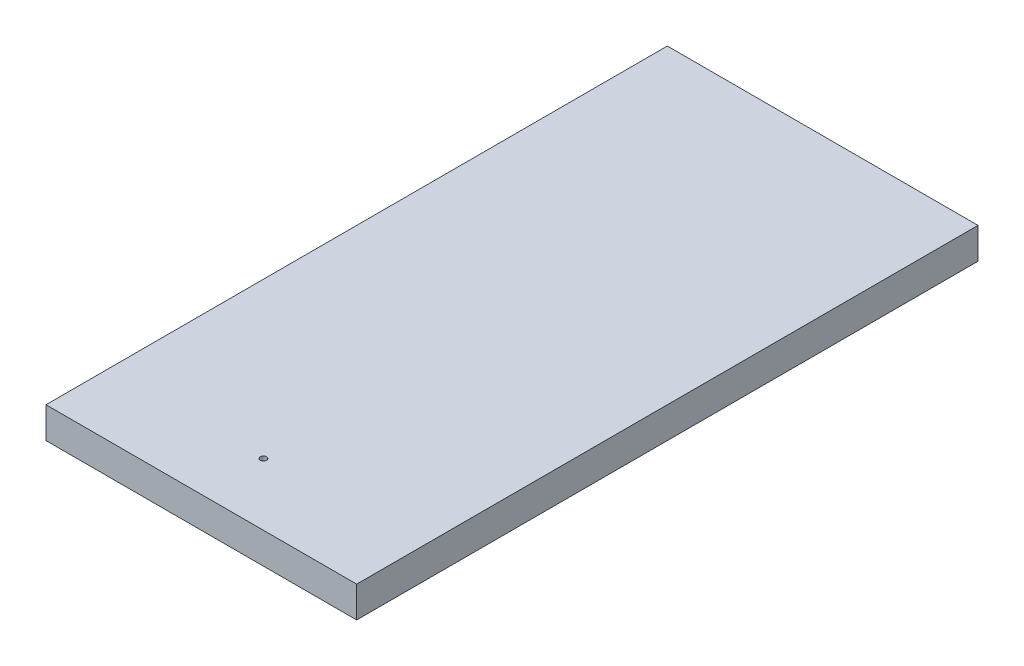
ISO-10303-21;
HEADER;
FILE_DESCRIPTION(('STEP AP214'),'2;1');
FILE_NAME('part.step','',(''),(''),'','','');
FILE_SCHEMA(('AUTOMOTIVE_DESIGN { 1 0 10303 214 1 1 1 1 }'));
ENDSEC;
DATA;
#1=APPLICATION_CONTEXT('core data for automotive mechanical design processes');
#2=APPLICATION_PROTOCOL_DEFINITION('international standard','automotive_design',2000,#1);
#3=PRODUCT_CONTEXT('',#1,'mechanical');
#4=PRODUCT('Part','Part','',(#3));
#5=PRODUCT_RELATED_PRODUCT_CATEGORY('part','',(#4));
#6=PRODUCT_DEFINITION_FORMATION('','',#4);
#7=PRODUCT_DEFINITION_CONTEXT('part definition',#1,'design');
#8=PRODUCT_DEFINITION('design','',#6,#7);
#9=PRODUCT_DEFINITION_SHAPE('','',#8);
#10=(LENGTH_UNIT() NAMED_UNIT(*) SI_UNIT(.MILLI.,.METRE.));
#11=(NAMED_UNIT(*) PLANE_ANGLE_UNIT() SI_UNIT($,.RADIAN.));
#12=(NAMED_UNIT(*) SI_UNIT($,.STERADIAN.) SOLID_ANGLE_UNIT());
#13=UNCERTAINTY_MEASURE_WITH_UNIT(LENGTH_MEASURE(1.E-05),#10,'distance_accuracy_value','');
#14=(GEOMETRIC_REPRESENTATION_CONTEXT(3) GLOBAL_UNCERTAINTY_ASSIGNED_CONTEXT((#13)) GLOBAL_UNIT_ASSIGNED_CONTEXT((#10,
#11,#12)) REPRESENTATION_CONTEXT('',''));
#15=CARTESIAN_POINT('',(0.,0.,0.));
#16=DIRECTION('',(0.,0.,1.));
#17=DIRECTION('',(1.,0.,0.));
#18=AXIS2_PLACEMENT_3D('',#15,#16,#17);
#19=CARTESIAN_POINT('',(125.,944.213598749006,450.));
#20=DIRECTION('',(0.,-1.,0.));
#21=DIRECTION('',(0.,0.,-1.));
#22=AXIS2_PLACEMENT_3D('',#19,#20,#21);
#23=CYLINDRICAL_SURFACE('',#22,2.5);
#24=CARTESIAN_POINT('',(125.,0.,450.));
#25=DIRECTION('',(0.,1.,0.));
#26=DIRECTION('',(0.,0.,1.));
#27=AXIS2_PLACEMENT_3D('',#24,#25,#26);
#28=CIRCLE('',#27,2.5);
#29=CARTESIAN_POINT('',(125.,0.,452.5));
#30=VERTEX_POINT('',#29);
#31=EDGE_CURVE('E9',#30,#30,#28,.T.);
#32=ORIENTED_EDGE('',*,*,#31,.T.);
#33=EDGE_LOOP('',(#32));
#34=FACE_BOUND('',#33,.T.);
#35=CARTESIAN_POINT('',(125.,-25.,450.));
#36=DIRECTION('',(0.,-1.,0.));
#37=DIRECTION('',(0.,0.,1.));
#38=AXIS2_PLACEMENT_3D('',#35,#36,#37);
#39=CIRCLE('',#38,2.5);
#40=CARTESIAN_POINT('',(125.,-25.,452.5));
#41=VERTEX_POINT('',#40);
#42=EDGE_CURVE('E26',#41,#41,#39,.T.);
#43=ORIENTED_EDGE('',*,*,#42,.T.);
#44=EDGE_LOOP('',(#43));
#45=FACE_BOUND('',#44,.T.);
#46=ADVANCED_FACE('F15',(#34,#45),#23,.F.);
#47=CARTESIAN_POINT('',(0.,0.,0.));
#48=DIRECTION('',(0.,1.,0.));
#49=DIRECTION('',(1.,0.,0.));
#50=AXIS2_PLACEMENT_3D('',#47,#48,#49);
#51=PLANE('',#50);
#52=DIRECTION('',(0.,0.,-1.));
#53=VECTOR('',#52,1.);
#54=CARTESIAN_POINT('',(250.,0.,500.));
#55=LINE('',#54,#53);
#56=CARTESIAN_POINT('',(250.,0.,500.));
#57=VERTEX_POINT('',#56);
#58=CARTESIAN_POINT('',(250.,0.,0.));
#59=VERTEX_POINT('',#58);
#60=EDGE_CURVE('E95',#57,#59,#55,.T.);
#61=ORIENTED_EDGE('',*,*,#60,.T.);
#62=DIRECTION('',(-1.,0.,0.));
#63=VECTOR('',#62,1.);
#64=CARTESIAN_POINT('',(250.,0.,0.));
#65=LINE('',#64,#63);
#66=CARTESIAN_POINT('',(0.,0.,0.));
#67=VERTEX_POINT('',#66);
#68=EDGE_CURVE('E87',#59,#67,#65,.T.);
#69=ORIENTED_EDGE('',*,*,#68,.T.);
#70=DIRECTION('',(0.,0.,1.));
#71=VECTOR('',#70,1.);
#72=CARTESIAN_POINT('',(0.,0.,0.));
#73=LINE('',#72,#71);
#74=CARTESIAN_POINT('',(0.,0.,500.));
#75=VERTEX_POINT('',#74);
#76=EDGE_CURVE('E72',#67,#75,#73,.T.);
#77=ORIENTED_EDGE('',*,*,#76,.T.);
#78=DIRECTION('',(1.,0.,0.));
#79=VECTOR('',#78,1.);
#80=CARTESIAN_POINT('',(0.,0.,500.));
#81=LINE('',#80,#79);
#82=EDGE_CURVE('E115',#75,#57,#81,.T.);
#83=ORIENTED_EDGE('',*,*,#82,.T.);
#84=EDGE_LOOP('',(#61,#69,#77,#83));
#85=FACE_BOUND('',#84,.T.);
#86=ORIENTED_EDGE('',*,*,#31,.F.);
#87=EDGE_LOOP('',(#86));
#88=FACE_BOUND('',#87,.T.);
#89=ADVANCED_FACE('F92',(#85,#88),#51,.T.);
#90=CARTESIAN_POINT('',(0.,-25.,0.));
#91=DIRECTION('',(0.,1.,0.));
#92=DIRECTION('',(1.,0.,0.));
#93=AXIS2_PLACEMENT_3D('',#90,#91,#92);
#94=PLANE('',#93);
#95=DIRECTION('',(0.,0.,-1.));
#96=VECTOR('',#95,1.);
#97=CARTESIAN_POINT('',(250.,-25.,500.));
#98=LINE('',#97,#96);
#99=CARTESIAN_POINT('',(250.,-25.,500.));
#100=VERTEX_POINT('',#99);
#101=CARTESIAN_POINT('',(250.,-25.,0.));
#102=VERTEX_POINT('',#101);
#103=EDGE_CURVE('E105',#100,#102,#98,.T.);
#104=ORIENTED_EDGE('',*,*,#103,.F.);
#105=DIRECTION('',(1.,0.,0.));
#106=VECTOR('',#105,1.);
#107=CARTESIAN_POINT('',(0.,-25.,500.));
#108=LINE('',#107,#106);
#109=CARTESIAN_POINT('',(0.,-25.,500.));
#110=VERTEX_POINT('',#109);
#111=EDGE_CURVE('E113',#110,#100,#108,.T.);
#112=ORIENTED_EDGE('',*,*,#111,.F.);
#113=DIRECTION('',(0.,0.,1.));
#114=VECTOR('',#113,1.);
#115=CARTESIAN_POINT('',(0.,-25.,0.));
#116=LINE('',#115,#114);
#117=CARTESIAN_POINT('',(0.,-25.,0.));
#118=VERTEX_POINT('',#117);
#119=EDGE_CURVE('E82',#118,#110,#116,.T.);
#120=ORIENTED_EDGE('',*,*,#119,.F.);
#121=DIRECTION('',(-1.,0.,0.));
#122=VECTOR('',#121,1.);
#123=CARTESIAN_POINT('',(250.,-25.,0.));
#124=LINE('',#123,#122);
#125=EDGE_CURVE('E89',#102,#118,#124,.T.);
#126=ORIENTED_EDGE('',*,*,#125,.F.);
#127=EDGE_LOOP('',(#104,#112,#120,#126));
#128=FACE_BOUND('',#127,.T.);
#129=ORIENTED_EDGE('',*,*,#42,.F.);
#130=EDGE_LOOP('',(#129));
#131=FACE_BOUND('',#130,.T.);
#132=ADVANCED_FACE('F17',(#128,#131),#94,.F.);
#133=CARTESIAN_POINT('',(0.,-25.,500.));
#134=DIRECTION('',(0.,0.,1.));
#135=DIRECTION('',(1.,0.,0.));
#136=AXIS2_PLACEMENT_3D('',#133,#134,#135);
#137=PLANE('',#136);
#138=ORIENTED_EDGE('',*,*,#82,.F.);
#139=DIRECTION('',(0.,1.,0.));
#140=VECTOR('',#139,1.);
#141=CARTESIAN_POINT('',(0.,-25.,500.));
#142=LINE('',#141,#140);
#143=EDGE_CURVE('E78',#110,#75,#142,.T.);
#144=ORIENTED_EDGE('',*,*,#143,.F.);
#145=ORIENTED_EDGE('',*,*,#111,.T.);
#146=DIRECTION('',(0.,1.,0.));
#147=VECTOR('',#146,1.);
#148=CARTESIAN_POINT('',(250.,-25.,500.));
#149=LINE('',#148,#147);
#150=EDGE_CURVE('E112',#100,#57,#149,.T.);
#151=ORIENTED_EDGE('',*,*,#150,.T.);
#152=EDGE_LOOP('',(#138,#144,#145,#151));
#153=FACE_BOUND('',#152,.T.);
#154=ADVANCED_FACE('F137',(#153),#137,.T.);
#155=CARTESIAN_POINT('',(0.,-25.,0.));
#156=DIRECTION('',(-1.,0.,0.));
#157=DIRECTION('',(0.,1.,0.));
#158=AXIS2_PLACEMENT_3D('',#155,#156,#157);
#159=PLANE('',#158);
#160=ORIENTED_EDGE('',*,*,#76,.F.);
#161=DIRECTION('',(0.,1.,0.));
#162=VECTOR('',#161,1.);
#163=CARTESIAN_POINT('',(0.,-25.,0.));
#164=LINE('',#163,#162);
#165=EDGE_CURVE('E19',#118,#67,#164,.T.);
#166=ORIENTED_EDGE('',*,*,#165,.F.);
#167=ORIENTED_EDGE('',*,*,#119,.T.);
#168=ORIENTED_EDGE('',*,*,#143,.T.);
#169=EDGE_LOOP('',(#160,#166,#167,#168));
#170=FACE_BOUND('',#169,.T.);
#171=ADVANCED_FACE('F74',(#170),#159,.T.);
#172=CARTESIAN_POINT('',(250.,-25.,0.));
#173=DIRECTION('',(0.,0.,-1.));
#174=DIRECTION('',(0.,-1.,0.));
#175=AXIS2_PLACEMENT_3D('',#172,#173,#174);
#176=PLANE('',#175);
#177=ORIENTED_EDGE('',*,*,#68,.F.);
#178=DIRECTION('',(0.,1.,0.));
#179=VECTOR('',#178,1.);
#180=CARTESIAN_POINT('',(250.,-25.,0.));
#181=LINE('',#180,#179);
#182=EDGE_CURVE('E97',#102,#59,#181,.T.);
#183=ORIENTED_EDGE('',*,*,#182,.F.);
#184=ORIENTED_EDGE('',*,*,#125,.T.);
#185=ORIENTED_EDGE('',*,*,#165,.T.);
#186=EDGE_LOOP('',(#177,#183,#184,#185));
#187=FACE_BOUND('',#186,.T.);
#188=ADVANCED_FACE('F85',(#187),#176,.T.);
#189=CARTESIAN_POINT('',(250.,-25.,500.));
#190=DIRECTION('',(1.,0.,0.));
#191=DIRECTION('',(0.,1.,0.));
#192=AXIS2_PLACEMENT_3D('',#189,#190,#191);
#193=PLANE('',#192);
#194=ORIENTED_EDGE('',*,*,#60,.F.);
#195=ORIENTED_EDGE('',*,*,#150,.F.);
#196=ORIENTED_EDGE('',*,*,#103,.T.);
#197=ORIENTED_EDGE('',*,*,#182,.T.);
#198=EDGE_LOOP('',(#194,#195,#196,#197));
#199=FACE_BOUND('',#198,.T.);
#200=ADVANCED_FACE('F153',(#199),#193,.T.);
#201=CLOSED_SHELL('',(#46,#89,#132,#154,#171,#188,#200));
#202=MANIFOLD_SOLID_BREP('B1',#201);
#203=ADVANCED_BREP_SHAPE_REPRESENTATION('',(#18,#202),#14);
#204=SHAPE_DEFINITION_REPRESENTATION(#9,#203);
ENDSEC;
END-ISO-10303-21;
